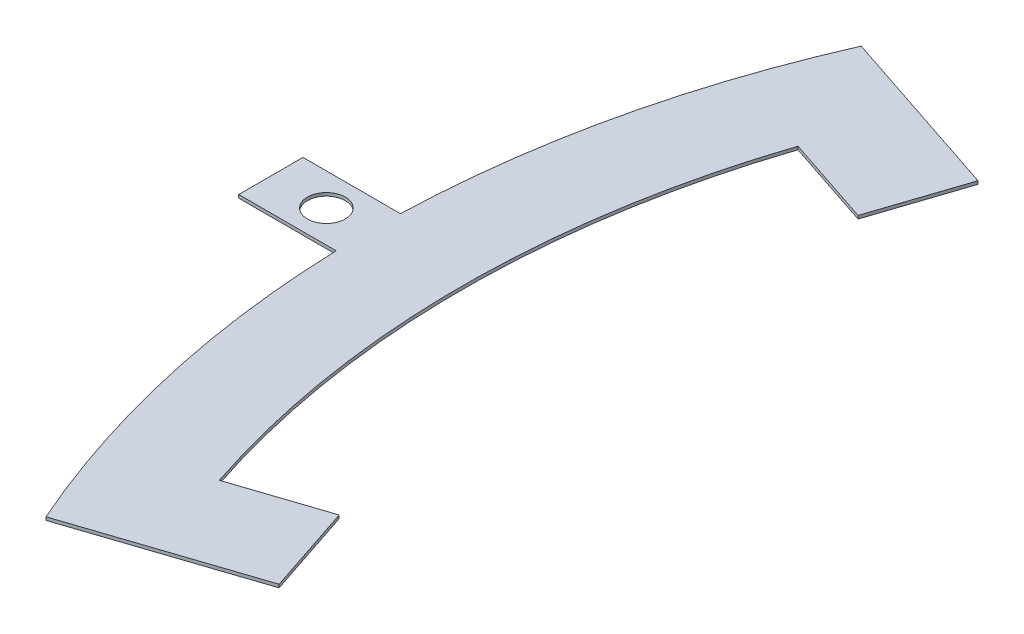
ISO-10303-21;
HEADER;
FILE_DESCRIPTION(('STEP AP214'),'2;1');
FILE_NAME('part.step','',(''),(''),'','','');
FILE_SCHEMA(('AUTOMOTIVE_DESIGN { 1 0 10303 214 1 1 1 1 }'));
ENDSEC;
DATA;
#1=APPLICATION_CONTEXT('core data for automotive mechanical design processes');
#2=APPLICATION_PROTOCOL_DEFINITION('international standard','automotive_design',2000,#1);
#3=PRODUCT_CONTEXT('',#1,'mechanical');
#4=PRODUCT('Part','Part','',(#3));
#5=PRODUCT_RELATED_PRODUCT_CATEGORY('part','',(#4));
#6=PRODUCT_DEFINITION_FORMATION('','',#4);
#7=PRODUCT_DEFINITION_CONTEXT('part definition',#1,'design');
#8=PRODUCT_DEFINITION('design','',#6,#7);
#9=PRODUCT_DEFINITION_SHAPE('','',#8);
#10=(LENGTH_UNIT() NAMED_UNIT(*) SI_UNIT(.MILLI.,.METRE.));
#11=(NAMED_UNIT(*) PLANE_ANGLE_UNIT() SI_UNIT($,.RADIAN.));
#12=(NAMED_UNIT(*) SI_UNIT($,.STERADIAN.) SOLID_ANGLE_UNIT());
#13=UNCERTAINTY_MEASURE_WITH_UNIT(LENGTH_MEASURE(1.E-05),#10,'distance_accuracy_value','');
#14=(GEOMETRIC_REPRESENTATION_CONTEXT(3) GLOBAL_UNCERTAINTY_ASSIGNED_CONTEXT((#13)) GLOBAL_UNIT_ASSIGNED_CONTEXT((#10,
#11,#12)) REPRESENTATION_CONTEXT('',''));
#15=CARTESIAN_POINT('',(0.,0.,0.));
#16=DIRECTION('',(0.,0.,1.));
#17=DIRECTION('',(1.,0.,0.));
#18=AXIS2_PLACEMENT_3D('',#15,#16,#17);
#19=CARTESIAN_POINT('',(0.,1.,0.));
#20=DIRECTION('',(0.,1.,0.));
#21=DIRECTION('',(0.,0.,1.));
#22=AXIS2_PLACEMENT_3D('',#19,#20,#21);
#23=PLANE('',#22);
#24=DIRECTION('',(0.31544831315575,0.,-0.948942759984601));
#25=VECTOR('',#24,1.);
#26=CARTESIAN_POINT('',(-246.822195025085,1.,-82.0488319773113));
#27=LINE('',#26,#25);
#28=CARTESIAN_POINT('',(-246.822195025085,1.,-82.0488319773113));
#29=VERTEX_POINT('',#28);
#30=CARTESIAN_POINT('',(-237.358745630412,1.,-110.517114776849));
#31=VERTEX_POINT('',#30);
#32=EDGE_CURVE('E200',#29,#31,#27,.T.);
#33=ORIENTED_EDGE('',*,*,#32,.T.);
#34=DIRECTION('',(-0.948942759984601,0.,-0.315448313155749));
#35=VECTOR('',#34,1.);
#36=CARTESIAN_POINT('',(-237.358745630412,1.,-110.517114776849));
#37=LINE('',#36,#35);
#38=CARTESIAN_POINT('',(-292.692887428905,1.,-128.911334561548));
#39=VERTEX_POINT('',#38);
#40=EDGE_CURVE('E112',#31,#39,#37,.T.);
#41=ORIENTED_EDGE('',*,*,#40,.T.);
#42=CARTESIAN_POINT('',(0.,1.,0.));
#43=DIRECTION('',(0.,1.,0.));
#44=DIRECTION('',(0.,0.,1.));
#45=AXIS2_PLACEMENT_3D('',#42,#43,#44);
#46=CIRCLE('',#45,319.823792939032);
#47=CARTESIAN_POINT('',(-319.662266039756,1.,-10.1633754352105));
#48=VERTEX_POINT('',#47);
#49=EDGE_CURVE('E237',#39,#48,#46,.T.);
#50=ORIENTED_EDGE('',*,*,#49,.T.);
#51=DIRECTION('',(-1.,0.,0.));
#52=VECTOR('',#51,1.);
#53=CARTESIAN_POINT('',(-319.662266039756,1.,-10.1633754352104));
#54=LINE('',#53,#52);
#55=CARTESIAN_POINT('',(-350.484670262976,1.,-10.1633754352104));
#56=VERTEX_POINT('',#55);
#57=EDGE_CURVE('E257',#48,#56,#54,.T.);
#58=ORIENTED_EDGE('',*,*,#57,.T.);
#59=DIRECTION('',(0.,0.,1.));
#60=VECTOR('',#59,1.);
#61=CARTESIAN_POINT('',(-350.484670262976,1.,-10.1633754352104));
#62=LINE('',#61,#60);
#63=CARTESIAN_POINT('',(-350.484670262976,1.,10.1633754352104));
#64=VERTEX_POINT('',#63);
#65=EDGE_CURVE('E253',#56,#64,#62,.T.);
#66=ORIENTED_EDGE('',*,*,#65,.T.);
#67=DIRECTION('',(1.,0.,0.));
#68=VECTOR('',#67,1.);
#69=CARTESIAN_POINT('',(-319.662266039756,1.,10.1633754352104));
#70=LINE('',#69,#68);
#71=CARTESIAN_POINT('',(-319.662266039756,1.,10.1633754352104));
#72=VERTEX_POINT('',#71);
#73=EDGE_CURVE('E256',#64,#72,#70,.T.);
#74=ORIENTED_EDGE('',*,*,#73,.T.);
#75=CARTESIAN_POINT('',(0.,1.,0.));
#76=DIRECTION('',(0.,1.,0.));
#77=DIRECTION('',(0.,0.,1.));
#78=AXIS2_PLACEMENT_3D('',#75,#76,#77);
#79=CIRCLE('',#78,319.823792939032);
#80=CARTESIAN_POINT('',(-292.692887428905,1.,128.911334561548));
#81=VERTEX_POINT('',#80);
#82=EDGE_CURVE('E261',#72,#81,#79,.T.);
#83=ORIENTED_EDGE('',*,*,#82,.T.);
#84=DIRECTION('',(0.948942759984601,0.,-0.315448313155749));
#85=VECTOR('',#84,1.);
#86=CARTESIAN_POINT('',(-237.358745630412,1.,110.517114776849));
#87=LINE('',#86,#85);
#88=CARTESIAN_POINT('',(-237.358745630412,1.,110.517114776849));
#89=VERTEX_POINT('',#88);
#90=EDGE_CURVE('E268',#81,#89,#87,.T.);
#91=ORIENTED_EDGE('',*,*,#90,.T.);
#92=DIRECTION('',(-0.31544831315575,0.,-0.948942759984601));
#93=VECTOR('',#92,1.);
#94=CARTESIAN_POINT('',(-237.358745630412,1.,110.517114776849));
#95=LINE('',#94,#93);
#96=CARTESIAN_POINT('',(-246.822195025085,1.,82.0488319773113));
#97=VERTEX_POINT('',#96);
#98=EDGE_CURVE('E143',#89,#97,#95,.T.);
#99=ORIENTED_EDGE('',*,*,#98,.T.);
#100=DIRECTION('',(-0.948942759984601,0.,0.31544831315575));
#101=VECTOR('',#100,1.);
#102=CARTESIAN_POINT('',(-246.822195025085,1.,82.0488319773113));
#103=LINE('',#102,#101);
#104=CARTESIAN_POINT('',(-275.290477824623,1.,91.5122813719838));
#105=VERTEX_POINT('',#104);
#106=EDGE_CURVE('E137',#97,#105,#103,.T.);
#107=ORIENTED_EDGE('',*,*,#106,.T.);
#108=CARTESIAN_POINT('',(0.,1.,0.));
#109=DIRECTION('',(0.,-1.,0.));
#110=DIRECTION('',(0.,0.,1.));
#111=AXIS2_PLACEMENT_3D('',#108,#109,#110);
#112=CIRCLE('',#111,290.102300616204);
#113=CARTESIAN_POINT('',(-275.290477824623,1.,-91.5122813719838));
#114=VERTEX_POINT('',#113);
#115=EDGE_CURVE('E141',#105,#114,#112,.T.);
#116=ORIENTED_EDGE('',*,*,#115,.T.);
#117=DIRECTION('',(0.948942759984601,0.,0.31544831315575));
#118=VECTOR('',#117,1.);
#119=CARTESIAN_POINT('',(-246.822195025085,1.,-82.0488319773113));
#120=LINE('',#119,#118);
#121=EDGE_CURVE('E57',#114,#29,#120,.T.);
#122=ORIENTED_EDGE('',*,*,#121,.T.);
#123=EDGE_LOOP('',(#33,#41,#50,#58,#66,#74,#83,#91,#99,#107,#116,#122));
#124=FACE_BOUND('',#123,.T.);
#125=CARTESIAN_POINT('',(-332.928005197061,1.,0.));
#126=DIRECTION('',(0.,1.,0.));
#127=DIRECTION('',(0.,0.,1.));
#128=AXIS2_PLACEMENT_3D('',#125,#126,#127);
#129=CIRCLE('',#128,5.99999999999999);
#130=CARTESIAN_POINT('',(-332.928005197061,1.,5.99999999999999));
#131=VERTEX_POINT('',#130);
#132=EDGE_CURVE('E170',#131,#131,#129,.T.);
#133=ORIENTED_EDGE('',*,*,#132,.F.);
#134=EDGE_LOOP('',(#133));
#135=FACE_BOUND('',#134,.T.);
#136=ADVANCED_FACE('F39',(#124,#135),#23,.T.);
#137=CARTESIAN_POINT('',(0.,0.,0.));
#138=DIRECTION('',(0.,1.,0.));
#139=DIRECTION('',(0.,0.,1.));
#140=AXIS2_PLACEMENT_3D('',#137,#138,#139);
#141=PLANE('',#140);
#142=DIRECTION('',(0.31544831315575,0.,-0.948942759984601));
#143=VECTOR('',#142,1.);
#144=CARTESIAN_POINT('',(-246.822195025085,0.,-82.0488319773113));
#145=LINE('',#144,#143);
#146=CARTESIAN_POINT('',(-246.822195025085,0.,-82.0488319773113));
#147=VERTEX_POINT('',#146);
#148=CARTESIAN_POINT('',(-237.358745630412,0.,-110.517114776849));
#149=VERTEX_POINT('',#148);
#150=EDGE_CURVE('E165',#147,#149,#145,.T.);
#151=ORIENTED_EDGE('',*,*,#150,.F.);
#152=DIRECTION('',(0.948942759984601,0.,0.31544831315575));
#153=VECTOR('',#152,1.);
#154=CARTESIAN_POINT('',(-246.822195025085,0.,-82.0488319773113));
#155=LINE('',#154,#153);
#156=CARTESIAN_POINT('',(-275.290477824623,0.,-91.5122813719838));
#157=VERTEX_POINT('',#156);
#158=EDGE_CURVE('E104',#157,#147,#155,.T.);
#159=ORIENTED_EDGE('',*,*,#158,.F.);
#160=CARTESIAN_POINT('',(0.,0.,0.));
#161=DIRECTION('',(0.,-1.,0.));
#162=DIRECTION('',(0.,0.,1.));
#163=AXIS2_PLACEMENT_3D('',#160,#161,#162);
#164=CIRCLE('',#163,290.102300616204);
#165=CARTESIAN_POINT('',(-275.290477824623,0.,91.5122813719838));
#166=VERTEX_POINT('',#165);
#167=EDGE_CURVE('E98',#166,#157,#164,.T.);
#168=ORIENTED_EDGE('',*,*,#167,.F.);
#169=DIRECTION('',(-0.948942759984601,0.,0.31544831315575));
#170=VECTOR('',#169,1.);
#171=CARTESIAN_POINT('',(-246.822195025085,0.,82.0488319773113));
#172=LINE('',#171,#170);
#173=CARTESIAN_POINT('',(-246.822195025085,0.,82.0488319773113));
#174=VERTEX_POINT('',#173);
#175=EDGE_CURVE('E152',#174,#166,#172,.T.);
#176=ORIENTED_EDGE('',*,*,#175,.F.);
#177=DIRECTION('',(-0.31544831315575,0.,-0.948942759984601));
#178=VECTOR('',#177,1.);
#179=CARTESIAN_POINT('',(-237.358745630412,0.,110.517114776849));
#180=LINE('',#179,#178);
#181=CARTESIAN_POINT('',(-237.358745630412,0.,110.517114776849));
#182=VERTEX_POINT('',#181);
#183=EDGE_CURVE('E191',#182,#174,#180,.T.);
#184=ORIENTED_EDGE('',*,*,#183,.F.);
#185=DIRECTION('',(0.948942759984601,0.,-0.315448313155749));
#186=VECTOR('',#185,1.);
#187=CARTESIAN_POINT('',(-237.358745630412,0.,110.517114776849));
#188=LINE('',#187,#186);
#189=CARTESIAN_POINT('',(-292.692887428905,0.,128.911334561548));
#190=VERTEX_POINT('',#189);
#191=EDGE_CURVE('E188',#190,#182,#188,.T.);
#192=ORIENTED_EDGE('',*,*,#191,.F.);
#193=CARTESIAN_POINT('',(0.,0.,0.));
#194=DIRECTION('',(0.,1.,0.));
#195=DIRECTION('',(0.,0.,1.));
#196=AXIS2_PLACEMENT_3D('',#193,#194,#195);
#197=CIRCLE('',#196,319.823792939032);
#198=CARTESIAN_POINT('',(-319.662266039756,0.,10.1633754352104));
#199=VERTEX_POINT('',#198);
#200=EDGE_CURVE('E185',#199,#190,#197,.T.);
#201=ORIENTED_EDGE('',*,*,#200,.F.);
#202=DIRECTION('',(1.,0.,0.));
#203=VECTOR('',#202,1.);
#204=CARTESIAN_POINT('',(-319.662266039756,0.,10.1633754352104));
#205=LINE('',#204,#203);
#206=CARTESIAN_POINT('',(-350.484670262976,0.,10.1633754352104));
#207=VERTEX_POINT('',#206);
#208=EDGE_CURVE('E182',#207,#199,#205,.T.);
#209=ORIENTED_EDGE('',*,*,#208,.F.);
#210=DIRECTION('',(0.,0.,1.));
#211=VECTOR('',#210,1.);
#212=CARTESIAN_POINT('',(-350.484670262976,0.,-10.1633754352104));
#213=LINE('',#212,#211);
#214=CARTESIAN_POINT('',(-350.484670262976,0.,-10.1633754352104));
#215=VERTEX_POINT('',#214);
#216=EDGE_CURVE('E179',#215,#207,#213,.T.);
#217=ORIENTED_EDGE('',*,*,#216,.F.);
#218=DIRECTION('',(-1.,0.,0.));
#219=VECTOR('',#218,1.);
#220=CARTESIAN_POINT('',(-319.662266039756,0.,-10.1633754352104));
#221=LINE('',#220,#219);
#222=CARTESIAN_POINT('',(-319.662266039756,0.,-10.1633754352105));
#223=VERTEX_POINT('',#222);
#224=EDGE_CURVE('E176',#223,#215,#221,.T.);
#225=ORIENTED_EDGE('',*,*,#224,.F.);
#226=CARTESIAN_POINT('',(0.,0.,0.));
#227=DIRECTION('',(0.,1.,0.));
#228=DIRECTION('',(0.,0.,1.));
#229=AXIS2_PLACEMENT_3D('',#226,#227,#228);
#230=CIRCLE('',#229,319.823792939032);
#231=CARTESIAN_POINT('',(-292.692887428905,0.,-128.911334561548));
#232=VERTEX_POINT('',#231);
#233=EDGE_CURVE('E173',#232,#223,#230,.T.);
#234=ORIENTED_EDGE('',*,*,#233,.F.);
#235=DIRECTION('',(-0.948942759984601,0.,-0.315448313155749));
#236=VECTOR('',#235,1.);
#237=CARTESIAN_POINT('',(-237.358745630412,0.,-110.517114776849));
#238=LINE('',#237,#236);
#239=EDGE_CURVE('E169',#149,#232,#238,.T.);
#240=ORIENTED_EDGE('',*,*,#239,.F.);
#241=EDGE_LOOP('',(#151,#159,#168,#176,#184,#192,#201,#209,#217,#225,#234,#240));
#242=FACE_BOUND('',#241,.T.);
#243=CARTESIAN_POINT('',(-332.928005197061,0.,0.));
#244=DIRECTION('',(0.,1.,0.));
#245=DIRECTION('',(0.,0.,1.));
#246=AXIS2_PLACEMENT_3D('',#243,#244,#245);
#247=CIRCLE('',#246,5.99999999999999);
#248=CARTESIAN_POINT('',(-332.928005197061,0.,5.99999999999999));
#249=VERTEX_POINT('',#248);
#250=EDGE_CURVE('E417',#249,#249,#247,.T.);
#251=ORIENTED_EDGE('',*,*,#250,.T.);
#252=EDGE_LOOP('',(#251));
#253=FACE_BOUND('',#252,.T.);
#254=ADVANCED_FACE('F241',(#242,#253),#141,.F.);
#255=CARTESIAN_POINT('',(-246.822195025085,1.,-82.0488319773113));
#256=DIRECTION('',(-0.948942759984601,0.,-0.31544831315575));
#257=DIRECTION('',(-0.31544831315575,0.,0.948942759984601));
#258=AXIS2_PLACEMENT_3D('',#255,#256,#257);
#259=PLANE('',#258);
#260=ORIENTED_EDGE('',*,*,#150,.T.);
#261=DIRECTION('',(0.,-1.,0.));
#262=VECTOR('',#261,1.);
#263=CARTESIAN_POINT('',(-237.358745630412,1.,-110.517114776849));
#264=LINE('',#263,#262);
#265=EDGE_CURVE('E11',#31,#149,#264,.T.);
#266=ORIENTED_EDGE('',*,*,#265,.F.);
#267=ORIENTED_EDGE('',*,*,#32,.F.);
#268=DIRECTION('',(0.,-1.,0.));
#269=VECTOR('',#268,1.);
#270=CARTESIAN_POINT('',(-246.822195025085,1.,-82.0488319773113));
#271=LINE('',#270,#269);
#272=EDGE_CURVE('E161',#29,#147,#271,.T.);
#273=ORIENTED_EDGE('',*,*,#272,.T.);
#274=EDGE_LOOP('',(#260,#266,#267,#273));
#275=FACE_BOUND('',#274,.T.);
#276=ADVANCED_FACE('F41',(#275),#259,.F.);
#277=CARTESIAN_POINT('',(-237.358745630412,1.,-110.517114776849));
#278=DIRECTION('',(-0.315448313155749,0.,0.948942759984601));
#279=DIRECTION('',(0.948942759984601,0.,0.315448313155749));
#280=AXIS2_PLACEMENT_3D('',#277,#278,#279);
#281=PLANE('',#280);
#282=ORIENTED_EDGE('',*,*,#239,.T.);
#283=DIRECTION('',(0.,-1.,0.));
#284=VECTOR('',#283,1.);
#285=CARTESIAN_POINT('',(-292.692887428905,1.,-128.911334561548));
#286=LINE('',#285,#284);
#287=EDGE_CURVE('E49',#39,#232,#286,.T.);
#288=ORIENTED_EDGE('',*,*,#287,.F.);
#289=ORIENTED_EDGE('',*,*,#40,.F.);
#290=ORIENTED_EDGE('',*,*,#265,.T.);
#291=EDGE_LOOP('',(#282,#288,#289,#290));
#292=FACE_BOUND('',#291,.T.);
#293=ADVANCED_FACE('F304',(#292),#281,.F.);
#294=CARTESIAN_POINT('',(0.,1.,0.));
#295=DIRECTION('',(0.,-1.,0.));
#296=DIRECTION('',(0.,0.,-1.));
#297=AXIS2_PLACEMENT_3D('',#294,#295,#296);
#298=CYLINDRICAL_SURFACE('',#297,319.823792939032);
#299=ORIENTED_EDGE('',*,*,#233,.T.);
#300=DIRECTION('',(0.,-1.,0.));
#301=VECTOR('',#300,1.);
#302=CARTESIAN_POINT('',(-319.662266039756,1.,-10.1633754352105));
#303=LINE('',#302,#301);
#304=EDGE_CURVE('E227',#48,#223,#303,.T.);
#305=ORIENTED_EDGE('',*,*,#304,.F.);
#306=ORIENTED_EDGE('',*,*,#49,.F.);
#307=ORIENTED_EDGE('',*,*,#287,.T.);
#308=EDGE_LOOP('',(#299,#305,#306,#307));
#309=FACE_BOUND('',#308,.T.);
#310=ADVANCED_FACE('F235',(#309),#298,.T.);
#311=CARTESIAN_POINT('',(-319.662266039756,1.,-10.1633754352104));
#312=DIRECTION('',(0.,0.,1.));
#313=DIRECTION('',(1.,0.,0.));
#314=AXIS2_PLACEMENT_3D('',#311,#312,#313);
#315=PLANE('',#314);
#316=ORIENTED_EDGE('',*,*,#224,.T.);
#317=DIRECTION('',(0.,-1.,0.));
#318=VECTOR('',#317,1.);
#319=CARTESIAN_POINT('',(-350.484670262976,1.,-10.1633754352104));
#320=LINE('',#319,#318);
#321=EDGE_CURVE('E223',#56,#215,#320,.T.);
#322=ORIENTED_EDGE('',*,*,#321,.F.);
#323=ORIENTED_EDGE('',*,*,#57,.F.);
#324=ORIENTED_EDGE('',*,*,#304,.T.);
#325=EDGE_LOOP('',(#316,#322,#323,#324));
#326=FACE_BOUND('',#325,.T.);
#327=ADVANCED_FACE('F247',(#326),#315,.F.);
#328=CARTESIAN_POINT('',(-350.484670262976,1.,-10.1633754352104));
#329=DIRECTION('',(1.,0.,0.));
#330=DIRECTION('',(0.,0.,-1.));
#331=AXIS2_PLACEMENT_3D('',#328,#329,#330);
#332=PLANE('',#331);
#333=ORIENTED_EDGE('',*,*,#216,.T.);
#334=DIRECTION('',(0.,-1.,0.));
#335=VECTOR('',#334,1.);
#336=CARTESIAN_POINT('',(-350.484670262976,1.,10.1633754352104));
#337=LINE('',#336,#335);
#338=EDGE_CURVE('E219',#64,#207,#337,.T.);
#339=ORIENTED_EDGE('',*,*,#338,.F.);
#340=ORIENTED_EDGE('',*,*,#65,.F.);
#341=ORIENTED_EDGE('',*,*,#321,.T.);
#342=EDGE_LOOP('',(#333,#339,#340,#341));
#343=FACE_BOUND('',#342,.T.);
#344=ADVANCED_FACE('F251',(#343),#332,.F.);
#345=CARTESIAN_POINT('',(-319.662266039756,1.,10.1633754352104));
#346=DIRECTION('',(0.,0.,-1.));
#347=DIRECTION('',(-1.,0.,0.));
#348=AXIS2_PLACEMENT_3D('',#345,#346,#347);
#349=PLANE('',#348);
#350=ORIENTED_EDGE('',*,*,#208,.T.);
#351=DIRECTION('',(0.,-1.,0.));
#352=VECTOR('',#351,1.);
#353=CARTESIAN_POINT('',(-319.662266039756,1.,10.1633754352104));
#354=LINE('',#353,#352);
#355=EDGE_CURVE('E215',#72,#199,#354,.T.);
#356=ORIENTED_EDGE('',*,*,#355,.F.);
#357=ORIENTED_EDGE('',*,*,#73,.F.);
#358=ORIENTED_EDGE('',*,*,#338,.T.);
#359=EDGE_LOOP('',(#350,#356,#357,#358));
#360=FACE_BOUND('',#359,.T.);
#361=ADVANCED_FACE('F317',(#360),#349,.F.);
#362=CARTESIAN_POINT('',(0.,1.,0.));
#363=DIRECTION('',(0.,-1.,0.));
#364=DIRECTION('',(0.,0.,-1.));
#365=AXIS2_PLACEMENT_3D('',#362,#363,#364);
#366=CYLINDRICAL_SURFACE('',#365,319.823792939032);
#367=ORIENTED_EDGE('',*,*,#200,.T.);
#368=DIRECTION('',(0.,-1.,0.));
#369=VECTOR('',#368,1.);
#370=CARTESIAN_POINT('',(-292.692887428905,1.,128.911334561548));
#371=LINE('',#370,#369);
#372=EDGE_CURVE('E211',#81,#190,#371,.T.);
#373=ORIENTED_EDGE('',*,*,#372,.F.);
#374=ORIENTED_EDGE('',*,*,#82,.F.);
#375=ORIENTED_EDGE('',*,*,#355,.T.);
#376=EDGE_LOOP('',(#367,#373,#374,#375));
#377=FACE_BOUND('',#376,.T.);
#378=ADVANCED_FACE('F320',(#377),#366,.T.);
#379=CARTESIAN_POINT('',(-237.358745630412,1.,110.517114776849));
#380=DIRECTION('',(-0.315448313155749,0.,-0.948942759984601));
#381=DIRECTION('',(-0.948942759984601,0.,0.315448313155749));
#382=AXIS2_PLACEMENT_3D('',#379,#380,#381);
#383=PLANE('',#382);
#384=ORIENTED_EDGE('',*,*,#191,.T.);
#385=DIRECTION('',(0.,-1.,0.));
#386=VECTOR('',#385,1.);
#387=CARTESIAN_POINT('',(-237.358745630412,1.,110.517114776849));
#388=LINE('',#387,#386);
#389=EDGE_CURVE('E207',#89,#182,#388,.T.);
#390=ORIENTED_EDGE('',*,*,#389,.F.);
#391=ORIENTED_EDGE('',*,*,#90,.F.);
#392=ORIENTED_EDGE('',*,*,#372,.T.);
#393=EDGE_LOOP('',(#384,#390,#391,#392));
#394=FACE_BOUND('',#393,.T.);
#395=ADVANCED_FACE('F276',(#394),#383,.F.);
#396=CARTESIAN_POINT('',(-237.358745630412,1.,110.517114776849));
#397=DIRECTION('',(-0.948942759984601,0.,0.31544831315575));
#398=DIRECTION('',(0.31544831315575,0.,0.948942759984601));
#399=AXIS2_PLACEMENT_3D('',#396,#397,#398);
#400=PLANE('',#399);
#401=ORIENTED_EDGE('',*,*,#183,.T.);
#402=DIRECTION('',(0.,-1.,0.));
#403=VECTOR('',#402,1.);
#404=CARTESIAN_POINT('',(-246.822195025085,1.,82.0488319773113));
#405=LINE('',#404,#403);
#406=EDGE_CURVE('E154',#97,#174,#405,.T.);
#407=ORIENTED_EDGE('',*,*,#406,.F.);
#408=ORIENTED_EDGE('',*,*,#98,.F.);
#409=ORIENTED_EDGE('',*,*,#389,.T.);
#410=EDGE_LOOP('',(#401,#407,#408,#409));
#411=FACE_BOUND('',#410,.T.);
#412=ADVANCED_FACE('F280',(#411),#400,.F.);
#413=CARTESIAN_POINT('',(-246.822195025085,1.,82.0488319773113));
#414=DIRECTION('',(0.31544831315575,0.,0.948942759984601));
#415=DIRECTION('',(0.948942759984601,0.,-0.31544831315575));
#416=AXIS2_PLACEMENT_3D('',#413,#414,#415);
#417=PLANE('',#416);
#418=ORIENTED_EDGE('',*,*,#175,.T.);
#419=DIRECTION('',(0.,-1.,0.));
#420=VECTOR('',#419,1.);
#421=CARTESIAN_POINT('',(-275.290477824623,1.,91.5122813719838));
#422=LINE('',#421,#420);
#423=EDGE_CURVE('E149',#105,#166,#422,.T.);
#424=ORIENTED_EDGE('',*,*,#423,.F.);
#425=ORIENTED_EDGE('',*,*,#106,.F.);
#426=ORIENTED_EDGE('',*,*,#406,.T.);
#427=EDGE_LOOP('',(#418,#424,#425,#426));
#428=FACE_BOUND('',#427,.T.);
#429=ADVANCED_FACE('F150',(#428),#417,.F.);
#430=CARTESIAN_POINT('',(0.,1.,0.));
#431=DIRECTION('',(0.,-1.,0.));
#432=DIRECTION('',(0.,0.,-1.));
#433=AXIS2_PLACEMENT_3D('',#430,#431,#432);
#434=CYLINDRICAL_SURFACE('',#433,290.102300616204);
#435=ORIENTED_EDGE('',*,*,#167,.T.);
#436=DIRECTION('',(0.,-1.,0.));
#437=VECTOR('',#436,1.);
#438=CARTESIAN_POINT('',(-275.290477824623,1.,-91.5122813719838));
#439=LINE('',#438,#437);
#440=EDGE_CURVE('E155',#114,#157,#439,.T.);
#441=ORIENTED_EDGE('',*,*,#440,.F.);
#442=ORIENTED_EDGE('',*,*,#115,.F.);
#443=ORIENTED_EDGE('',*,*,#423,.T.);
#444=EDGE_LOOP('',(#435,#441,#442,#443));
#445=FACE_BOUND('',#444,.T.);
#446=ADVANCED_FACE('F157',(#445),#434,.F.);
#447=CARTESIAN_POINT('',(-246.822195025085,1.,-82.0488319773113));
#448=DIRECTION('',(0.31544831315575,0.,-0.948942759984601));
#449=DIRECTION('',(-0.948942759984601,0.,-0.31544831315575));
#450=AXIS2_PLACEMENT_3D('',#447,#448,#449);
#451=PLANE('',#450);
#452=ORIENTED_EDGE('',*,*,#158,.T.);
#453=ORIENTED_EDGE('',*,*,#272,.F.);
#454=ORIENTED_EDGE('',*,*,#121,.F.);
#455=ORIENTED_EDGE('',*,*,#440,.T.);
#456=EDGE_LOOP('',(#452,#453,#454,#455));
#457=FACE_BOUND('',#456,.T.);
#458=ADVANCED_FACE('F284',(#457),#451,.F.);
#459=CARTESIAN_POINT('',(-332.928005197061,1.,0.));
#460=DIRECTION('',(0.,-1.,0.));
#461=DIRECTION('',(0.,0.,-1.));
#462=AXIS2_PLACEMENT_3D('',#459,#460,#461);
#463=CYLINDRICAL_SURFACE('',#462,5.99999999999999);
#464=ORIENTED_EDGE('',*,*,#132,.T.);
#465=EDGE_LOOP('',(#464));
#466=FACE_BOUND('',#465,.T.);
#467=ORIENTED_EDGE('',*,*,#250,.F.);
#468=EDGE_LOOP('',(#467));
#469=FACE_BOUND('',#468,.T.);
#470=ADVANCED_FACE('F286',(#466,#469),#463,.F.);
#471=CLOSED_SHELL('',(#136,#254,#276,#293,#310,#327,#344,#361,#378,#395,#412,#429,#446,#458,#470));
#472=MANIFOLD_SOLID_BREP('B2',#471);
#473=ADVANCED_BREP_SHAPE_REPRESENTATION('',(#18,#472),#14);
#474=SHAPE_DEFINITION_REPRESENTATION(#9,#473);
ENDSEC;
END-ISO-10303-21;
